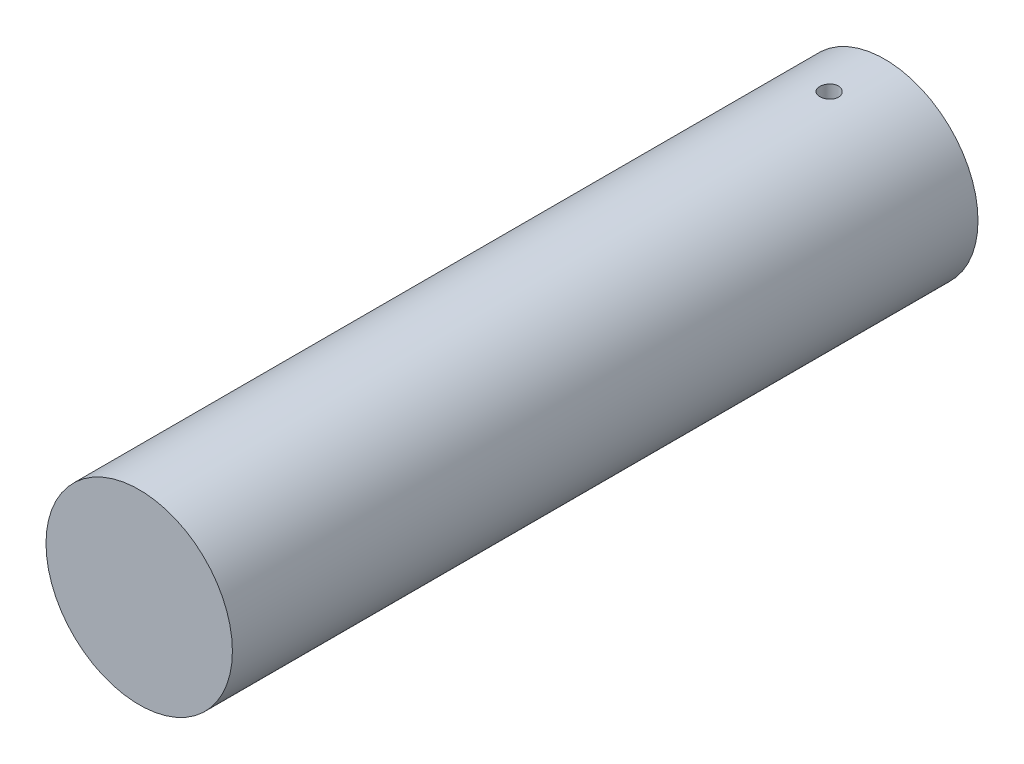
ISO-10303-21;
HEADER;
FILE_DESCRIPTION(('STEP AP214'),'2;1');
FILE_NAME('part.step','',(''),(''),'','','');
FILE_SCHEMA(('AUTOMOTIVE_DESIGN { 1 0 10303 214 1 1 1 1 }'));
ENDSEC;
DATA;
#1=APPLICATION_CONTEXT('core data for automotive mechanical design processes');
#2=APPLICATION_PROTOCOL_DEFINITION('international standard','automotive_design',2000,#1);
#3=PRODUCT_CONTEXT('',#1,'mechanical');
#4=PRODUCT('Part','Part','',(#3));
#5=PRODUCT_RELATED_PRODUCT_CATEGORY('part','',(#4));
#6=PRODUCT_DEFINITION_FORMATION('','',#4);
#7=PRODUCT_DEFINITION_CONTEXT('part definition',#1,'design');
#8=PRODUCT_DEFINITION('design','',#6,#7);
#9=PRODUCT_DEFINITION_SHAPE('','',#8);
#10=(LENGTH_UNIT() NAMED_UNIT(*) SI_UNIT(.MILLI.,.METRE.));
#11=(NAMED_UNIT(*) PLANE_ANGLE_UNIT() SI_UNIT($,.RADIAN.));
#12=(NAMED_UNIT(*) SI_UNIT($,.STERADIAN.) SOLID_ANGLE_UNIT());
#13=UNCERTAINTY_MEASURE_WITH_UNIT(LENGTH_MEASURE(1.E-05),#10,'distance_accuracy_value','');
#14=(GEOMETRIC_REPRESENTATION_CONTEXT(3) GLOBAL_UNCERTAINTY_ASSIGNED_CONTEXT((#13)) GLOBAL_UNIT_ASSIGNED_CONTEXT((#10,
#11,#12)) REPRESENTATION_CONTEXT('',''));
#15=CARTESIAN_POINT('',(0.,0.,0.));
#16=DIRECTION('',(0.,0.,1.));
#17=DIRECTION('',(1.,0.,0.));
#18=AXIS2_PLACEMENT_3D('',#15,#16,#17);
#19=CARTESIAN_POINT('',(0.,0.,400.));
#20=DIRECTION('',(0.,0.,-1.));
#21=DIRECTION('',(-1.,0.,0.));
#22=AXIS2_PLACEMENT_3D('',#19,#20,#21);
#23=CYLINDRICAL_SURFACE('',#22,50.);
#24=CARTESIAN_POINT('',(0.,-50.,34.8952029870002));
#25=CARTESIAN_POINT('',(0.140100461033937,-50.0000003743881,34.895204364755));
#26=CARTESIAN_POINT('',(0.280179892133931,-49.9994099664565,34.8893123239418));
#27=CARTESIAN_POINT('',(0.559384605481633,-49.9970656286844,34.8657878978724));
#28=CARTESIAN_POINT('',(0.698509650807406,-49.9953114197949,34.8481526969089));
#29=CARTESIAN_POINT('',(0.974876810291466,-49.990686488879,34.8012480416856));
#30=CARTESIAN_POINT('',(1.11211733275272,-49.9878148767159,34.7719693116404));
#31=CARTESIAN_POINT('',(1.38367953746195,-49.9810352616415,34.7019792984352));
#32=CARTESIAN_POINT('',(1.51800013207783,-49.9771268794695,34.6612638312834));
#33=CARTESIAN_POINT('',(1.78258815793808,-49.968388862618,34.5687457868183));
#34=CARTESIAN_POINT('',(1.9128594168042,-49.9635601307267,34.5169540683808));
#35=CARTESIAN_POINT('',(2.16861600653063,-49.9531129442553,34.4026116901427));
#36=CARTESIAN_POINT('',(2.29409955432331,-49.9474941990341,34.3400570688329));
#37=CARTESIAN_POINT('',(2.53927920710544,-49.9356297496778,34.2046878153797));
#38=CARTESIAN_POINT('',(2.65897858413043,-49.9293844063018,34.1318790773254));
#39=CARTESIAN_POINT('',(2.89187409366607,-49.9164369111371,33.9764614090493));
#40=CARTESIAN_POINT('',(3.00506780046608,-49.90973459097,33.893848858106));
#41=CARTESIAN_POINT('',(3.22442516584175,-49.8960438865044,33.7191792811017));
#42=CARTESIAN_POINT('',(3.33056800916345,-49.8890547458808,33.6270961728259));
#43=CARTESIAN_POINT('',(3.53476522468386,-49.8750029081307,33.4342932003426));
#44=CARTESIAN_POINT('',(3.6328165925971,-49.8679401847701,33.3335701562679));
#45=CARTESIAN_POINT('',(3.82006793418719,-49.853945639318,33.1242575257502));
#46=CARTESIAN_POINT('',(3.90927074723064,-49.8470137758174,33.0156704822213));
#47=CARTESIAN_POINT('',(4.07826305039189,-49.8334722976176,32.7913212208076));
#48=CARTESIAN_POINT('',(4.15804905479459,-49.8268628027738,32.6755563700292));
#49=CARTESIAN_POINT('',(4.30773494085765,-49.8141453282559,32.4374900573207));
#50=CARTESIAN_POINT('',(4.37761719102717,-49.8080382509359,32.3151774587301));
#51=CARTESIAN_POINT('',(4.50685113325592,-49.796510955401,32.0650240009224));
#52=CARTESIAN_POINT('',(4.5661989151386,-49.7910909924413,31.9371811107821));
#53=CARTESIAN_POINT('',(4.67388203969832,-49.7810984182545,31.6769539278422));
#54=CARTESIAN_POINT('',(4.72222165895323,-49.7765254780955,31.5445714217212));
#55=CARTESIAN_POINT('',(4.80757979958036,-49.7683532658288,31.2761619581492));
#56=CARTESIAN_POINT('',(4.84459415265808,-49.7647543522704,31.1401336788471));
#57=CARTESIAN_POINT('',(4.93794230581997,-49.7556112743006,30.7290524600536));
#58=CARTESIAN_POINT('',(4.97706409180383,-49.7516744142284,30.4498325609828));
#59=CARTESIAN_POINT('',(5.00789059851941,-49.7485802587524,29.8889162128937));
#60=CARTESIAN_POINT('',(4.9995965655709,-49.7494228377215,29.6072198291637));
#61=CARTESIAN_POINT('',(4.93601762379308,-49.7557708498252,29.0502377545796));
#62=CARTESIAN_POINT('',(4.88090320838524,-49.7612593648233,28.774932522684));
#63=CARTESIAN_POINT('',(4.72549673300413,-49.7762565790783,28.2375101386265));
#64=CARTESIAN_POINT('',(4.62520406273851,-49.7857653326426,27.9753931646719));
#65=CARTESIAN_POINT('',(4.38210419746261,-49.8077505089504,27.4712358651623));
#66=CARTESIAN_POINT('',(4.23922134072076,-49.8202322051485,27.2292322578748));
#67=CARTESIAN_POINT('',(3.91505020964741,-49.846752576903,26.7725766941133));
#68=CARTESIAN_POINT('',(3.73376081125102,-49.8607912980239,26.5579255384728));
#69=CARTESIAN_POINT('',(3.33697054240559,-49.8889192682764,26.1610760759321));
#70=CARTESIAN_POINT('',(3.12132238898974,-49.9030084673536,25.9790249933666));
#71=CARTESIAN_POINT('',(2.66244741395265,-49.9295914532222,25.6536848066778));
#72=CARTESIAN_POINT('',(2.41922056141157,-49.9420852382248,25.5103957460131));
#73=CARTESIAN_POINT('',(1.91199052704802,-49.9640737835429,25.2666528896544));
#74=CARTESIAN_POINT('',(1.64798373156272,-49.9735680207869,25.1662065639574));
#75=CARTESIAN_POINT('',(1.10673608703645,-49.988482372022,25.011108402394));
#76=CARTESIAN_POINT('',(0.829495634016399,-49.9939026078476,24.9564551970627));
#77=CARTESIAN_POINT('',(0.270925495326698,-50.0000425834211,24.8946814483109));
#78=CARTESIAN_POINT('',(-0.0103815106741383,-50.000782413361,24.8873577446372));
#79=CARTESIAN_POINT('',(-0.57021896643182,-49.9975320878656,24.9199173033445));
#80=CARTESIAN_POINT('',(-0.84874945364846,-49.993541996332,24.959799927963));
#81=CARTESIAN_POINT('',(-1.39454103462632,-49.9812930768513,25.0854714597308));
#82=CARTESIAN_POINT('',(-1.66182424652395,-49.9730430954945,25.1711652429951));
#83=CARTESIAN_POINT('',(-2.17822160525502,-49.953199943438,25.3859288735821));
#84=CARTESIAN_POINT('',(-2.42733534458292,-49.9416066977843,25.5149996934027));
#85=CARTESIAN_POINT('',(-2.90124090708418,-49.9163237649944,25.8133571189089));
#86=CARTESIAN_POINT('',(-3.12594832200516,-49.9026271744651,25.9827772020796));
#87=CARTESIAN_POINT('',(-3.54380809329823,-49.8746966491831,26.3568335552603));
#88=CARTESIAN_POINT('',(-3.73695965742386,-49.8604627009505,26.5614707091712));
#89=CARTESIAN_POINT('',(-4.08693063657039,-49.8330011856591,27.0010350003905));
#90=CARTESIAN_POINT('',(-4.2436167191349,-49.8197774270285,27.2360685551133));
#91=CARTESIAN_POINT('',(-4.51529096798641,-49.7958917029636,27.7292430022897));
#92=CARTESIAN_POINT('',(-4.63027970447967,-49.7852297024982,27.9873835786975));
#93=CARTESIAN_POINT('',(-4.81507725706781,-49.7676970839323,28.5189347072354));
#94=CARTESIAN_POINT('',(-4.88496539977526,-49.7608198120965,28.7923175245558));
#95=CARTESIAN_POINT('',(-4.97781551006116,-49.7516193745049,29.3471636384232));
#96=CARTESIAN_POINT('',(-5.00077882348839,-49.7492960781367,29.6286267029861));
#97=CARTESIAN_POINT('',(-4.99958027457784,-49.7494127947303,30.0498102719439));
#98=CARTESIAN_POINT('',(-4.99328044671943,-49.7500479099195,30.1898022381427));
#99=CARTESIAN_POINT('',(-4.96896519008512,-49.7524830219634,30.4687407631231));
#100=CARTESIAN_POINT('',(-4.9509541101499,-49.754282586412,30.6076876906014));
#101=CARTESIAN_POINT('',(-4.9033339265936,-49.7589979715237,30.8836025532875));
#102=CARTESIAN_POINT('',(-4.87372057237539,-49.7619142012784,31.0205697441104));
#103=CARTESIAN_POINT('',(-4.80312740218269,-49.7687776142575,31.2914653228423));
#104=CARTESIAN_POINT('',(-4.7621517427028,-49.7727244204516,31.4253948026452));
#105=CARTESIAN_POINT('',(-4.66911475363506,-49.7815382320036,31.6893475376908));
#106=CARTESIAN_POINT('',(-4.6170509625864,-49.7864054416556,31.8193699182691));
#107=CARTESIAN_POINT('',(-4.50223825911722,-49.7969192874116,32.0745180032577));
#108=CARTESIAN_POINT('',(-4.43949325070048,-49.8025656385956,32.1996454762884));
#109=CARTESIAN_POINT('',(-4.30372744333054,-49.8144815572328,32.4442223444777));
#110=CARTESIAN_POINT('',(-4.23070301224569,-49.82075134474,32.5636697125835));
#111=CARTESIAN_POINT('',(-4.07493978433922,-49.8337332394463,32.7959640120119));
#112=CARTESIAN_POINT('',(-3.99220451871275,-49.8404451854741,32.9088133203912));
#113=CARTESIAN_POINT('',(-3.81717528907235,-49.8541564093712,33.1276784225087));
#114=CARTESIAN_POINT('',(-3.72483897640454,-49.8611568702573,33.2336602784372));
#115=CARTESIAN_POINT('',(-3.53161206753512,-49.8752152226331,33.4374373940356));
#116=CARTESIAN_POINT('',(-3.43072460522393,-49.8822730922333,33.5352356270122));
#117=CARTESIAN_POINT('',(-3.22101009987079,-49.8962537831342,33.7220589506942));
#118=CARTESIAN_POINT('',(-3.11217826461907,-49.9031765196754,33.8110786686293));
#119=CARTESIAN_POINT('',(-2.88743471180054,-49.9166844506629,33.9796175585912));
#120=CARTESIAN_POINT('',(-2.77152562327502,-49.9232697688008,34.0591402264991));
#121=CARTESIAN_POINT('',(-2.5330592655813,-49.9359380152465,34.2083748844378));
#122=CARTESIAN_POINT('',(-2.41048371893775,-49.9420194337243,34.2780578019));
#123=CARTESIAN_POINT('',(-2.15990777377624,-49.9534835762051,34.4068139573743));
#124=CARTESIAN_POINT('',(-2.03190938317773,-49.9588665558713,34.4658910806898));
#125=CARTESIAN_POINT('',(-1.77145809043289,-49.9687792484329,34.5729956268302));
#126=CARTESIAN_POINT('',(-1.63900893926476,-49.9733096595983,34.6210320993607));
#127=CARTESIAN_POINT('',(-1.37054695395703,-49.9813929477421,34.7057554380894));
#128=CARTESIAN_POINT('',(-1.23453500404774,-49.9849460647987,34.7424450919762));
#129=CARTESIAN_POINT('',(-0.917364218647636,-49.9919068178199,34.8137796624687));
#130=CARTESIAN_POINT('',(-0.735250267899011,-49.9949297207431,34.844284055927));
#131=CARTESIAN_POINT('',(-0.368745400564769,-49.9989760613865,34.8849947698619));
#132=CARTESIAN_POINT('',(-0.184354493372665,-49.9999995073526,34.8952011740491));
#133=CARTESIAN_POINT('',(0.,-50.,34.8952029870002));
#134=B_SPLINE_CURVE_WITH_KNOTS('',3,(#24,#25,#26,#27,#28,#29,#30,#31,#32,#33,#34,#35,#36,#37,
#38,#39,#40,#41,#42,#43,#44,#45,#46,#47,#48,#49,#50,#51,#52,#53,#54,#55,#56,#57,#58,#59,#60,#61,
#62,#63,#64,#65,#66,#67,#68,#69,#70,#71,#72,#73,#74,#75,#76,#77,#78,#79,#80,#81,#82,#83,#84,#85,
#86,#87,#88,#89,#90,#91,#92,#93,#94,#95,#96,#97,#98,#99,#100,#101,#102,#103,#104,#105,#106,#107,
#108,#109,#110,#111,#112,#113,#114,#115,#116,#117,#118,#119,#120,#121,#122,#123,#124,#125,#126,
#127,#128,#129,#130,#131,#132,#133),.UNSPECIFIED.,.T.,.F.,(4,2,2,2,2,2,2,2,2,2,2,2,2,2,2,2,2,2,
2,2,2,2,2,2,2,2,2,2,2,2,2,2,2,2,2,2,2,2,2,2,2,2,2,2,2,2,2,2,2,2,2,2,2,2,4),(0.,
0.420140168309288,0.840381111696768,1.26095751168313,1.68168797529278,2.10200784094379,
2.52248274628058,2.94271694071896,3.36310682092266,3.78468715311913,4.20642331622125,
4.62802370983913,5.04977967635892,5.47227730157367,5.89493142271308,6.31742106512358,
6.74006601944364,7.58160289957827,8.42311766010726,9.26158116937396,10.1000560054001,
10.9400293659632,11.7800273138747,12.6237280071288,13.467429646307,14.3112783319975,
15.1551017810904,15.9953007277063,16.8354883232756,17.6739380620337,18.5124065997918,
19.3536883347534,20.1949911878299,21.0393234777484,21.8836442210871,22.7264758269686,
23.5692832592977,23.9892798829599,24.4091206346367,24.8291153427782,25.2489566130453,
25.6688911814504,26.0886725912905,26.5086027007735,26.9283805794993,27.3500956078529,
27.7716567456625,28.1934743134009,28.6151361275947,29.0380188241247,29.460746285189,
29.883126003011,30.305401867917,30.8582554897697,31.4111068316036),.UNSPECIFIED.);
#135=CARTESIAN_POINT('',(0.,-50.,34.8952029870002));
#136=VERTEX_POINT('',#135);
#137=EDGE_CURVE('E10',#136,#136,#134,.T.);
#138=ORIENTED_EDGE('',*,*,#137,.T.);
#139=EDGE_LOOP('',(#138));
#140=FACE_BOUND('',#139,.T.);
#141=CARTESIAN_POINT('',(0.,50.,34.8952029870002));
#142=CARTESIAN_POINT('',(-0.140100461033937,50.0000003743881,34.895204364755));
#143=CARTESIAN_POINT('',(-0.280179892133931,49.9994099664565,34.8893123239418));
#144=CARTESIAN_POINT('',(-0.559384605481633,49.9970656286844,34.8657878978724));
#145=CARTESIAN_POINT('',(-0.698509650807406,49.9953114197949,34.8481526969089));
#146=CARTESIAN_POINT('',(-0.974876810291466,49.990686488879,34.8012480416856));
#147=CARTESIAN_POINT('',(-1.11211733275272,49.9878148767159,34.7719693116404));
#148=CARTESIAN_POINT('',(-1.38367953746195,49.9810352616415,34.7019792984352));
#149=CARTESIAN_POINT('',(-1.51800013207783,49.9771268794695,34.6612638312834));
#150=CARTESIAN_POINT('',(-1.78258815793808,49.968388862618,34.5687457868183));
#151=CARTESIAN_POINT('',(-1.9128594168042,49.9635601307267,34.5169540683808));
#152=CARTESIAN_POINT('',(-2.16861600653063,49.9531129442553,34.4026116901427));
#153=CARTESIAN_POINT('',(-2.29409955432331,49.9474941990341,34.3400570688329));
#154=CARTESIAN_POINT('',(-2.53927920710544,49.9356297496778,34.2046878153797));
#155=CARTESIAN_POINT('',(-2.65897858413043,49.9293844063018,34.1318790773254));
#156=CARTESIAN_POINT('',(-2.89187409366607,49.9164369111371,33.9764614090493));
#157=CARTESIAN_POINT('',(-3.00506780046608,49.90973459097,33.893848858106));
#158=CARTESIAN_POINT('',(-3.22442516584175,49.8960438865044,33.7191792811017));
#159=CARTESIAN_POINT('',(-3.33056800916345,49.8890547458808,33.6270961728259));
#160=CARTESIAN_POINT('',(-3.53476522468386,49.8750029081307,33.4342932003426));
#161=CARTESIAN_POINT('',(-3.6328165925971,49.8679401847701,33.3335701562679));
#162=CARTESIAN_POINT('',(-3.82006793418719,49.853945639318,33.1242575257502));
#163=CARTESIAN_POINT('',(-3.90927074723064,49.8470137758174,33.0156704822213));
#164=CARTESIAN_POINT('',(-4.07826305039189,49.8334722976176,32.7913212208076));
#165=CARTESIAN_POINT('',(-4.15804905479459,49.8268628027738,32.6755563700292));
#166=CARTESIAN_POINT('',(-4.30773494085765,49.8141453282559,32.4374900573207));
#167=CARTESIAN_POINT('',(-4.37761719102717,49.8080382509359,32.3151774587301));
#168=CARTESIAN_POINT('',(-4.50685113325592,49.796510955401,32.0650240009224));
#169=CARTESIAN_POINT('',(-4.5661989151386,49.7910909924413,31.9371811107821));
#170=CARTESIAN_POINT('',(-4.67388203969832,49.7810984182545,31.6769539278422));
#171=CARTESIAN_POINT('',(-4.72222165895323,49.7765254780955,31.5445714217212));
#172=CARTESIAN_POINT('',(-4.80757979958036,49.7683532658288,31.2761619581492));
#173=CARTESIAN_POINT('',(-4.84459415265808,49.7647543522704,31.1401336788471));
#174=CARTESIAN_POINT('',(-4.93794230581997,49.7556112743006,30.7290524600536));
#175=CARTESIAN_POINT('',(-4.97706409180383,49.7516744142284,30.4498325609828));
#176=CARTESIAN_POINT('',(-5.00789059851941,49.7485802587524,29.8889162128937));
#177=CARTESIAN_POINT('',(-4.9995965655709,49.7494228377215,29.6072198291637));
#178=CARTESIAN_POINT('',(-4.93601762379308,49.7557708498252,29.0502377545796));
#179=CARTESIAN_POINT('',(-4.88090320838524,49.7612593648233,28.774932522684));
#180=CARTESIAN_POINT('',(-4.72549673300413,49.7762565790783,28.2375101386265));
#181=CARTESIAN_POINT('',(-4.62520406273851,49.7857653326426,27.9753931646719));
#182=CARTESIAN_POINT('',(-4.38210419746261,49.8077505089504,27.4712358651623));
#183=CARTESIAN_POINT('',(-4.23922134072076,49.8202322051485,27.2292322578748));
#184=CARTESIAN_POINT('',(-3.91505020964741,49.846752576903,26.7725766941133));
#185=CARTESIAN_POINT('',(-3.73376081125102,49.8607912980239,26.5579255384728));
#186=CARTESIAN_POINT('',(-3.33697054240559,49.8889192682764,26.1610760759321));
#187=CARTESIAN_POINT('',(-3.12132238898974,49.9030084673536,25.9790249933666));
#188=CARTESIAN_POINT('',(-2.66244741395265,49.9295914532222,25.6536848066778));
#189=CARTESIAN_POINT('',(-2.41922056141157,49.9420852382248,25.5103957460131));
#190=CARTESIAN_POINT('',(-1.91199052704802,49.9640737835429,25.2666528896544));
#191=CARTESIAN_POINT('',(-1.64798373156272,49.9735680207869,25.1662065639574));
#192=CARTESIAN_POINT('',(-1.10673608703645,49.988482372022,25.011108402394));
#193=CARTESIAN_POINT('',(-0.829495634016399,49.9939026078476,24.9564551970627));
#194=CARTESIAN_POINT('',(-0.270925495326698,50.0000425834211,24.8946814483109));
#195=CARTESIAN_POINT('',(0.0103815106741383,50.000782413361,24.8873577446372));
#196=CARTESIAN_POINT('',(0.57021896643182,49.9975320878656,24.9199173033445));
#197=CARTESIAN_POINT('',(0.84874945364846,49.993541996332,24.959799927963));
#198=CARTESIAN_POINT('',(1.39454103462632,49.9812930768513,25.0854714597308));
#199=CARTESIAN_POINT('',(1.66182424652395,49.9730430954945,25.1711652429951));
#200=CARTESIAN_POINT('',(2.17822160525502,49.953199943438,25.3859288735821));
#201=CARTESIAN_POINT('',(2.42733534458292,49.9416066977843,25.5149996934027));
#202=CARTESIAN_POINT('',(2.90124090708418,49.9163237649944,25.8133571189089));
#203=CARTESIAN_POINT('',(3.12594832200516,49.9026271744651,25.9827772020796));
#204=CARTESIAN_POINT('',(3.54380809329823,49.8746966491831,26.3568335552603));
#205=CARTESIAN_POINT('',(3.73695965742386,49.8604627009505,26.5614707091712));
#206=CARTESIAN_POINT('',(4.08693063657039,49.8330011856591,27.0010350003905));
#207=CARTESIAN_POINT('',(4.2436167191349,49.8197774270285,27.2360685551133));
#208=CARTESIAN_POINT('',(4.51529096798641,49.7958917029636,27.7292430022897));
#209=CARTESIAN_POINT('',(4.63027970447967,49.7852297024982,27.9873835786975));
#210=CARTESIAN_POINT('',(4.81507725706781,49.7676970839323,28.5189347072354));
#211=CARTESIAN_POINT('',(4.88496539977526,49.7608198120965,28.7923175245558));
#212=CARTESIAN_POINT('',(4.97781551006116,49.7516193745049,29.3471636384232));
#213=CARTESIAN_POINT('',(5.00077882348839,49.7492960781367,29.6286267029861));
#214=CARTESIAN_POINT('',(4.99958027457784,49.7494127947303,30.0498102719439));
#215=CARTESIAN_POINT('',(4.99328044671943,49.7500479099195,30.1898022381427));
#216=CARTESIAN_POINT('',(4.96896519008512,49.7524830219634,30.4687407631231));
#217=CARTESIAN_POINT('',(4.9509541101499,49.754282586412,30.6076876906014));
#218=CARTESIAN_POINT('',(4.9033339265936,49.7589979715237,30.8836025532875));
#219=CARTESIAN_POINT('',(4.87372057237539,49.7619142012784,31.0205697441104));
#220=CARTESIAN_POINT('',(4.80312740218269,49.7687776142575,31.2914653228423));
#221=CARTESIAN_POINT('',(4.7621517427028,49.7727244204516,31.4253948026452));
#222=CARTESIAN_POINT('',(4.66911475363506,49.7815382320036,31.6893475376908));
#223=CARTESIAN_POINT('',(4.6170509625864,49.7864054416556,31.8193699182691));
#224=CARTESIAN_POINT('',(4.50223825911722,49.7969192874116,32.0745180032577));
#225=CARTESIAN_POINT('',(4.43949325070048,49.8025656385956,32.1996454762884));
#226=CARTESIAN_POINT('',(4.30372744333054,49.8144815572328,32.4442223444777));
#227=CARTESIAN_POINT('',(4.23070301224569,49.82075134474,32.5636697125835));
#228=CARTESIAN_POINT('',(4.07493978433922,49.8337332394463,32.7959640120119));
#229=CARTESIAN_POINT('',(3.99220451871275,49.8404451854741,32.9088133203912));
#230=CARTESIAN_POINT('',(3.81717528907235,49.8541564093712,33.1276784225087));
#231=CARTESIAN_POINT('',(3.72483897640454,49.8611568702573,33.2336602784372));
#232=CARTESIAN_POINT('',(3.53161206753512,49.8752152226331,33.4374373940356));
#233=CARTESIAN_POINT('',(3.43072460522393,49.8822730922333,33.5352356270122));
#234=CARTESIAN_POINT('',(3.22101009987079,49.8962537831342,33.7220589506942));
#235=CARTESIAN_POINT('',(3.11217826461907,49.9031765196754,33.8110786686293));
#236=CARTESIAN_POINT('',(2.88743471180054,49.9166844506629,33.9796175585912));
#237=CARTESIAN_POINT('',(2.77152562327502,49.9232697688008,34.0591402264991));
#238=CARTESIAN_POINT('',(2.5330592655813,49.9359380152465,34.2083748844378));
#239=CARTESIAN_POINT('',(2.41048371893775,49.9420194337243,34.2780578019));
#240=CARTESIAN_POINT('',(2.15990777377624,49.9534835762051,34.4068139573743));
#241=CARTESIAN_POINT('',(2.03190938317773,49.9588665558713,34.4658910806898));
#242=CARTESIAN_POINT('',(1.77145809043289,49.9687792484329,34.5729956268302));
#243=CARTESIAN_POINT('',(1.63900893926476,49.9733096595983,34.6210320993607));
#244=CARTESIAN_POINT('',(1.37054695395703,49.9813929477421,34.7057554380894));
#245=CARTESIAN_POINT('',(1.23453500404774,49.9849460647987,34.7424450919762));
#246=CARTESIAN_POINT('',(0.917364218647636,49.9919068178199,34.8137796624687));
#247=CARTESIAN_POINT('',(0.735250267899011,49.9949297207431,34.844284055927));
#248=CARTESIAN_POINT('',(0.368745400564769,49.9989760613865,34.8849947698619));
#249=CARTESIAN_POINT('',(0.184354493372665,49.9999995073526,34.8952011740491));
#250=CARTESIAN_POINT('',(0.,50.,34.8952029870002));
#251=B_SPLINE_CURVE_WITH_KNOTS('',3,(#141,#142,#143,#144,#145,#146,#147,#148,#149,#150,#151,
#152,#153,#154,#155,#156,#157,#158,#159,#160,#161,#162,#163,#164,#165,#166,#167,#168,#169,#170,
#171,#172,#173,#174,#175,#176,#177,#178,#179,#180,#181,#182,#183,#184,#185,#186,#187,#188,#189,
#190,#191,#192,#193,#194,#195,#196,#197,#198,#199,#200,#201,#202,#203,#204,#205,#206,#207,#208,
#209,#210,#211,#212,#213,#214,#215,#216,#217,#218,#219,#220,#221,#222,#223,#224,#225,#226,#227,
#228,#229,#230,#231,#232,#233,#234,#235,#236,#237,#238,#239,#240,#241,#242,#243,#244,#245,#246,
#247,#248,#249,#250),.UNSPECIFIED.,.T.,.F.,(4,2,2,2,2,2,2,2,2,2,2,2,2,2,2,2,2,2,2,2,2,2,2,2,2,2,
2,2,2,2,2,2,2,2,2,2,2,2,2,2,2,2,2,2,2,2,2,2,2,2,2,2,2,2,4),(0.,0.420140168309288,
0.840381111696768,1.26095751168313,1.68168797529278,2.10200784094379,2.52248274628058,
2.94271694071896,3.36310682092266,3.78468715311913,4.20642331622125,4.62802370983913,
5.04977967635892,5.47227730157367,5.89493142271308,6.31742106512358,6.74006601944364,
7.58160289957827,8.42311766010726,9.26158116937396,10.1000560054001,10.9400293659632,
11.7800273138747,12.6237280071288,13.467429646307,14.3112783319975,15.1551017810904,
15.9953007277063,16.8354883232756,17.6739380620337,18.5124065997918,19.3536883347534,
20.1949911878299,21.0393234777484,21.8836442210871,22.7264758269686,23.5692832592977,
23.9892798829599,24.4091206346367,24.8291153427782,25.2489566130453,25.6688911814504,
26.0886725912905,26.5086027007735,26.9283805794993,27.3500956078529,27.7716567456625,
28.1934743134009,28.6151361275947,29.0380188241247,29.460746285189,29.883126003011,
30.305401867917,30.8582554897697,31.4111068316036),.UNSPECIFIED.);
#252=CARTESIAN_POINT('',(0.,50.,34.8952029870002));
#253=VERTEX_POINT('',#252);
#254=EDGE_CURVE('E46',#253,#253,#251,.T.);
#255=ORIENTED_EDGE('',*,*,#254,.T.);
#256=EDGE_LOOP('',(#255));
#257=FACE_BOUND('',#256,.T.);
#258=CARTESIAN_POINT('',(0.,0.,400.));
#259=DIRECTION('',(0.,0.,1.));
#260=DIRECTION('',(1.,0.,0.));
#261=AXIS2_PLACEMENT_3D('',#258,#259,#260);
#262=CIRCLE('',#261,50.);
#263=CARTESIAN_POINT('',(50.,0.,400.));
#264=VERTEX_POINT('',#263);
#265=EDGE_CURVE('E50',#264,#264,#262,.T.);
#266=ORIENTED_EDGE('',*,*,#265,.F.);
#267=EDGE_LOOP('',(#266));
#268=FACE_BOUND('',#267,.T.);
#269=CARTESIAN_POINT('',(0.,0.,0.));
#270=DIRECTION('',(0.,0.,1.));
#271=DIRECTION('',(1.,0.,0.));
#272=AXIS2_PLACEMENT_3D('',#269,#270,#271);
#273=CIRCLE('',#272,50.);
#274=CARTESIAN_POINT('',(50.,0.,0.));
#275=VERTEX_POINT('',#274);
#276=EDGE_CURVE('E54',#275,#275,#273,.T.);
#277=ORIENTED_EDGE('',*,*,#276,.T.);
#278=EDGE_LOOP('',(#277));
#279=FACE_BOUND('',#278,.T.);
#280=ADVANCED_FACE('F35',(#140,#257,#268,#279),#23,.T.);
#281=CARTESIAN_POINT('',(0.,0.,400.));
#282=DIRECTION('',(0.,0.,1.));
#283=DIRECTION('',(1.,0.,0.));
#284=AXIS2_PLACEMENT_3D('',#281,#282,#283);
#285=PLANE('',#284);
#286=ORIENTED_EDGE('',*,*,#265,.T.);
#287=EDGE_LOOP('',(#286));
#288=FACE_BOUND('',#287,.T.);
#289=ADVANCED_FACE('F66',(#288),#285,.T.);
#290=CARTESIAN_POINT('',(0.,0.,0.));
#291=DIRECTION('',(0.,0.,1.));
#292=DIRECTION('',(1.,0.,0.));
#293=AXIS2_PLACEMENT_3D('',#290,#291,#292);
#294=PLANE('',#293);
#295=ORIENTED_EDGE('',*,*,#276,.F.);
#296=EDGE_LOOP('',(#295));
#297=FACE_BOUND('',#296,.T.);
#298=ADVANCED_FACE('F64',(#297),#294,.F.);
#299=CARTESIAN_POINT('',(0.,-50.,29.8952029870002));
#300=DIRECTION('',(0.,1.,0.));
#301=DIRECTION('',(0.,0.,1.));
#302=AXIS2_PLACEMENT_3D('',#299,#300,#301);
#303=CYLINDRICAL_SURFACE('',#302,5.);
#304=ORIENTED_EDGE('',*,*,#254,.F.);
#305=EDGE_LOOP('',(#304));
#306=FACE_BOUND('',#305,.T.);
#307=ORIENTED_EDGE('',*,*,#137,.F.);
#308=EDGE_LOOP('',(#307));
#309=FACE_BOUND('',#308,.T.);
#310=ADVANCED_FACE('F60',(#306,#309),#303,.F.);
#311=CLOSED_SHELL('',(#280,#289,#298,#310));
#312=MANIFOLD_SOLID_BREP('B2',#311);
#313=ADVANCED_BREP_SHAPE_REPRESENTATION('',(#18,#312),#14);
#314=SHAPE_DEFINITION_REPRESENTATION(#9,#313);
ENDSEC;
END-ISO-10303-21;
